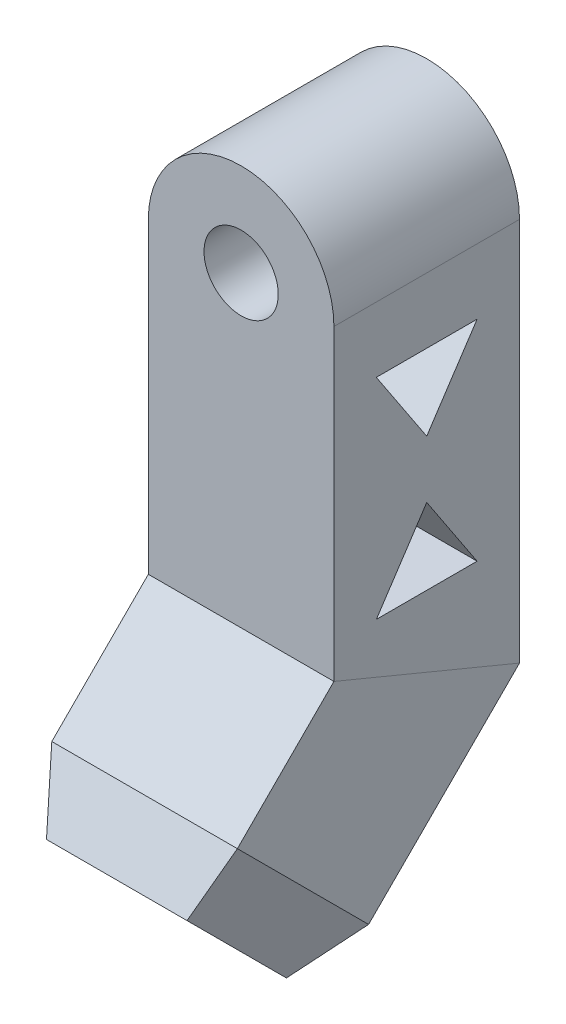
ISO-10303-21;
HEADER;
FILE_DESCRIPTION(('STEP AP214'),'2;1');
FILE_NAME('part.step','',(''),(''),'','','');
FILE_SCHEMA(('AUTOMOTIVE_DESIGN { 1 0 10303 214 1 1 1 1 }'));
ENDSEC;
DATA;
#1=APPLICATION_CONTEXT('core data for automotive mechanical design processes');
#2=APPLICATION_PROTOCOL_DEFINITION('international standard','automotive_design',2000,#1);
#3=PRODUCT_CONTEXT('',#1,'mechanical');
#4=PRODUCT('Part','Part','',(#3));
#5=PRODUCT_RELATED_PRODUCT_CATEGORY('part','',(#4));
#6=PRODUCT_DEFINITION_FORMATION('','',#4);
#7=PRODUCT_DEFINITION_CONTEXT('part definition',#1,'design');
#8=PRODUCT_DEFINITION('design','',#6,#7);
#9=PRODUCT_DEFINITION_SHAPE('','',#8);
#10=(LENGTH_UNIT() NAMED_UNIT(*) SI_UNIT(.MILLI.,.METRE.));
#11=(NAMED_UNIT(*) PLANE_ANGLE_UNIT() SI_UNIT($,.RADIAN.));
#12=(NAMED_UNIT(*) SI_UNIT($,.STERADIAN.) SOLID_ANGLE_UNIT());
#13=UNCERTAINTY_MEASURE_WITH_UNIT(LENGTH_MEASURE(1.E-05),#10,'distance_accuracy_value','');
#14=(GEOMETRIC_REPRESENTATION_CONTEXT(3) GLOBAL_UNCERTAINTY_ASSIGNED_CONTEXT((#13)) GLOBAL_UNIT_ASSIGNED_CONTEXT((#10,
#11,#12)) REPRESENTATION_CONTEXT('',''));
#15=CARTESIAN_POINT('',(0.,0.,0.));
#16=DIRECTION('',(0.,0.,1.));
#17=DIRECTION('',(1.,0.,0.));
#18=AXIS2_PLACEMENT_3D('',#15,#16,#17);
#19=CARTESIAN_POINT('',(19.05,45.0786722599583,7.26209610324912));
#20=DIRECTION('',(-1.,0.,0.));
#21=DIRECTION('',(0.,0.,1.));
#22=AXIS2_PLACEMENT_3D('',#19,#20,#21);
#23=PLANE('',#22);
#24=DIRECTION('',(0.,0.382683432365091,0.923879532511287));
#25=VECTOR('',#24,1.);
#26=CARTESIAN_POINT('',(19.05,42.5318762324136,41.3600079491902));
#27=LINE('',#26,#25);
#28=CARTESIAN_POINT('',(19.05,17.5092316367925,-19.05));
#29=VERTEX_POINT('',#28);
#30=CARTESIAN_POINT('',(19.05,33.2907683632075,19.05));
#31=VERTEX_POINT('',#30);
#32=EDGE_CURVE('E278',#29,#31,#27,.T.);
#33=ORIENTED_EDGE('',*,*,#32,.T.);
#34=DIRECTION('',(0.,-0.707106781186546,0.707106781186549));
#35=VECTOR('',#34,1.);
#36=CARTESIAN_POINT('',(19.05,45.0786722599583,7.26209610324912));
#37=LINE('',#36,#35);
#38=CARTESIAN_POINT('',(19.05,13.4703841816038,38.8703841816038));
#39=VERTEX_POINT('',#38);
#40=EDGE_CURVE('E49',#31,#39,#37,.T.);
#41=ORIENTED_EDGE('',*,*,#40,.T.);
#42=DIRECTION('',(0.,-0.707106781186549,-0.707106781186546));
#43=VECTOR('',#42,1.);
#44=CARTESIAN_POINT('',(19.05,13.4703841816038,38.8703841816038));
#45=LINE('',#44,#43);
#46=CARTESIAN_POINT('',(19.05,-13.4703841816038,11.9296158183964));
#47=VERTEX_POINT('',#46);
#48=EDGE_CURVE('E317',#39,#47,#45,.T.);
#49=ORIENTED_EDGE('',*,*,#48,.T.);
#50=DIRECTION('',(0.,-0.707106781186546,0.707106781186549));
#51=VECTOR('',#50,1.);
#52=CARTESIAN_POINT('',(19.05,18.1379038967508,-19.6786722599583));
#53=LINE('',#52,#51);
#54=EDGE_CURVE('E328',#29,#47,#53,.T.);
#55=ORIENTED_EDGE('',*,*,#54,.F.);
#56=EDGE_LOOP('',(#33,#41,#49,#55));
#57=FACE_BOUND('',#56,.T.);
#58=ADVANCED_FACE('F45',(#57),#23,.F.);
#59=CARTESIAN_POINT('',(-19.05,18.1379038967508,-19.6786722599583));
#60=DIRECTION('',(0.,0.707106781186549,0.707106781186546));
#61=DIRECTION('',(0.,-0.707106781186546,0.707106781186549));
#62=AXIS2_PLACEMENT_3D('',#59,#60,#61);
#63=PLANE('',#62);
#64=DIRECTION('',(1.,0.,0.));
#65=VECTOR('',#64,1.);
#66=CARTESIAN_POINT('',(-19.05,17.5092316367925,-19.05));
#67=LINE('',#66,#65);
#68=CARTESIAN_POINT('',(-19.05,17.5092316367925,-19.05));
#69=VERTEX_POINT('',#68);
#70=EDGE_CURVE('E11',#69,#29,#67,.T.);
#71=ORIENTED_EDGE('',*,*,#70,.T.);
#72=ORIENTED_EDGE('',*,*,#54,.T.);
#73=DIRECTION('',(-1.,0.,0.));
#74=VECTOR('',#73,1.);
#75=CARTESIAN_POINT('',(-19.05,-13.4703841816038,11.9296158183964));
#76=LINE('',#75,#74);
#77=CARTESIAN_POINT('',(-19.05,-13.4703841816038,11.9296158183964));
#78=VERTEX_POINT('',#77);
#79=EDGE_CURVE('E313',#47,#78,#76,.T.);
#80=ORIENTED_EDGE('',*,*,#79,.T.);
#81=DIRECTION('',(0.,-0.707106781186546,0.707106781186549));
#82=VECTOR('',#81,1.);
#83=CARTESIAN_POINT('',(-19.05,18.1379038967508,-19.6786722599583));
#84=LINE('',#83,#82);
#85=EDGE_CURVE('E325',#69,#78,#84,.T.);
#86=ORIENTED_EDGE('',*,*,#85,.F.);
#87=EDGE_LOOP('',(#71,#72,#80,#86));
#88=FACE_BOUND('',#87,.T.);
#89=ADVANCED_FACE('F352',(#88),#63,.F.);
#90=CARTESIAN_POINT('',(-19.05,45.0786722599583,7.26209610324912));
#91=DIRECTION('',(1.,0.,0.));
#92=DIRECTION('',(0.,0.,-1.));
#93=AXIS2_PLACEMENT_3D('',#90,#91,#92);
#94=PLANE('',#93);
#95=DIRECTION('',(0.,-0.382683432365091,-0.923879532511287));
#96=VECTOR('',#95,1.);
#97=CARTESIAN_POINT('',(-19.05,42.5318762324136,41.3600079491902));
#98=LINE('',#97,#96);
#99=CARTESIAN_POINT('',(-19.05,33.2907683632075,19.05));
#100=VERTEX_POINT('',#99);
#101=EDGE_CURVE('E55',#100,#69,#98,.T.);
#102=ORIENTED_EDGE('',*,*,#101,.T.);
#103=ORIENTED_EDGE('',*,*,#85,.T.);
#104=DIRECTION('',(0.,0.707106781186549,0.707106781186546));
#105=VECTOR('',#104,1.);
#106=CARTESIAN_POINT('',(-19.05,13.4703841816038,38.8703841816038));
#107=LINE('',#106,#105);
#108=CARTESIAN_POINT('',(-19.05,13.4703841816038,38.8703841816038));
#109=VERTEX_POINT('',#108);
#110=EDGE_CURVE('E309',#78,#109,#107,.T.);
#111=ORIENTED_EDGE('',*,*,#110,.T.);
#112=DIRECTION('',(0.,-0.707106781186546,0.707106781186549));
#113=VECTOR('',#112,1.);
#114=CARTESIAN_POINT('',(-19.05,45.0786722599583,7.26209610324912));
#115=LINE('',#114,#113);
#116=EDGE_CURVE('E321',#100,#109,#115,.T.);
#117=ORIENTED_EDGE('',*,*,#116,.F.);
#118=EDGE_LOOP('',(#102,#103,#111,#117));
#119=FACE_BOUND('',#118,.T.);
#120=ADVANCED_FACE('F350',(#119),#94,.F.);
#121=CARTESIAN_POINT('',(-19.05,45.0786722599583,7.26209610324912));
#122=DIRECTION('',(0.,-0.707106781186549,-0.707106781186546));
#123=DIRECTION('',(0.,0.707106781186546,-0.707106781186549));
#124=AXIS2_PLACEMENT_3D('',#121,#122,#123);
#125=PLANE('',#124);
#126=DIRECTION('',(-1.,0.,0.));
#127=VECTOR('',#126,1.);
#128=CARTESIAN_POINT('',(-19.05,33.2907683632075,19.05));
#129=LINE('',#128,#127);
#130=EDGE_CURVE('E274',#31,#100,#129,.T.);
#131=ORIENTED_EDGE('',*,*,#130,.T.);
#132=ORIENTED_EDGE('',*,*,#116,.T.);
#133=DIRECTION('',(1.,0.,0.));
#134=VECTOR('',#133,1.);
#135=CARTESIAN_POINT('',(-19.05,13.4703841816038,38.8703841816038));
#136=LINE('',#135,#134);
#137=EDGE_CURVE('E247',#109,#39,#136,.T.);
#138=ORIENTED_EDGE('',*,*,#137,.T.);
#139=ORIENTED_EDGE('',*,*,#40,.F.);
#140=EDGE_LOOP('',(#131,#132,#138,#139));
#141=FACE_BOUND('',#140,.T.);
#142=ADVANCED_FACE('F47',(#141),#125,.F.);
#143=CARTESIAN_POINT('',(-19.05,96.393,19.05));
#144=DIRECTION('',(0.,0.,-1.));
#145=DIRECTION('',(0.,1.,0.));
#146=AXIS2_PLACEMENT_3D('',#143,#144,#145);
#147=PLANE('',#146);
#148=CARTESIAN_POINT('',(0.,96.393,19.05));
#149=DIRECTION('',(0.,0.,1.));
#150=DIRECTION('',(1.,0.,0.));
#151=AXIS2_PLACEMENT_3D('',#148,#149,#150);
#152=CIRCLE('',#151,7.62);
#153=CARTESIAN_POINT('',(7.62,96.393,19.05));
#154=VERTEX_POINT('',#153);
#155=EDGE_CURVE('E224',#154,#154,#152,.T.);
#156=ORIENTED_EDGE('',*,*,#155,.F.);
#157=EDGE_LOOP('',(#156));
#158=FACE_BOUND('',#157,.T.);
#159=DIRECTION('',(0.,-1.,0.));
#160=VECTOR('',#159,1.);
#161=CARTESIAN_POINT('',(19.05,96.393,19.05));
#162=LINE('',#161,#160);
#163=CARTESIAN_POINT('',(19.05,96.393,19.05));
#164=VERTEX_POINT('',#163);
#165=EDGE_CURVE('E289',#164,#31,#162,.T.);
#166=ORIENTED_EDGE('',*,*,#165,.F.);
#167=CARTESIAN_POINT('',(0.,96.393,19.05));
#168=DIRECTION('',(0.,0.,-1.));
#169=DIRECTION('',(0.,1.,0.));
#170=AXIS2_PLACEMENT_3D('',#167,#168,#169);
#171=CIRCLE('',#170,19.05);
#172=CARTESIAN_POINT('',(-19.05,96.393,19.05));
#173=VERTEX_POINT('',#172);
#174=EDGE_CURVE('E236',#164,#173,#171,.F.);
#175=ORIENTED_EDGE('',*,*,#174,.T.);
#176=DIRECTION('',(0.,-1.,0.));
#177=VECTOR('',#176,1.);
#178=CARTESIAN_POINT('',(-19.05,96.393,19.05));
#179=LINE('',#178,#177);
#180=EDGE_CURVE('E296',#173,#100,#179,.T.);
#181=ORIENTED_EDGE('',*,*,#180,.T.);
#182=ORIENTED_EDGE('',*,*,#130,.F.);
#183=EDGE_LOOP('',(#166,#175,#181,#182));
#184=FACE_BOUND('',#183,.T.);
#185=ADVANCED_FACE('F383',(#158,#184),#147,.F.);
#186=CARTESIAN_POINT('',(-19.05,96.393,19.05));
#187=DIRECTION('',(1.,0.,0.));
#188=DIRECTION('',(0.,0.,-1.));
#189=AXIS2_PLACEMENT_3D('',#186,#187,#188);
#190=PLANE('',#189);
#191=DIRECTION('',(0.,0.833779661271235,0.552097343274196));
#192=VECTOR('',#191,1.);
#193=CARTESIAN_POINT('',(-19.05,82.9999979899142,10.3451695250034));
#194=LINE('',#193,#192);
#195=CARTESIAN_POINT('',(-19.05,67.3766807480723,0.));
#196=VERTEX_POINT('',#195);
#197=CARTESIAN_POINT('',(-19.05,82.9999979899142,10.3451695250034));
#198=VERTEX_POINT('',#197);
#199=EDGE_CURVE('E174',#196,#198,#194,.T.);
#200=ORIENTED_EDGE('',*,*,#199,.F.);
#201=DIRECTION('',(0.,-0.833779661271235,0.552097343274195));
#202=VECTOR('',#201,1.);
#203=CARTESIAN_POINT('',(-19.05,82.9999979899142,-10.3451695250034));
#204=LINE('',#203,#202);
#205=CARTESIAN_POINT('',(-19.05,82.9999979899142,-10.3451695250034));
#206=VERTEX_POINT('',#205);
#207=EDGE_CURVE('E63',#206,#196,#204,.T.);
#208=ORIENTED_EDGE('',*,*,#207,.F.);
#209=DIRECTION('',(0.,0.,-1.));
#210=VECTOR('',#209,1.);
#211=CARTESIAN_POINT('',(-19.05,82.9999979899142,-10.3451695250034));
#212=LINE('',#211,#210);
#213=EDGE_CURVE('E170',#198,#206,#212,.T.);
#214=ORIENTED_EDGE('',*,*,#213,.F.);
#215=EDGE_LOOP('',(#200,#208,#214));
#216=FACE_BOUND('',#215,.T.);
#217=DIRECTION('',(0.,0.833779661271235,-0.552097343274196));
#218=VECTOR('',#217,1.);
#219=CARTESIAN_POINT('',(-19.05,39.9683350787719,10.3451695250034));
#220=LINE('',#219,#218);
#221=CARTESIAN_POINT('',(-19.05,39.9683350787719,10.3451695250034));
#222=VERTEX_POINT('',#221);
#223=CARTESIAN_POINT('',(-19.05,55.5916523206137,0.));
#224=VERTEX_POINT('',#223);
#225=EDGE_CURVE('E203',#222,#224,#220,.T.);
#226=ORIENTED_EDGE('',*,*,#225,.F.);
#227=DIRECTION('',(0.,0.,1.));
#228=VECTOR('',#227,1.);
#229=CARTESIAN_POINT('',(-19.05,39.9683350787719,-10.3451695250034));
#230=LINE('',#229,#228);
#231=CARTESIAN_POINT('',(-19.05,39.9683350787719,-10.3451695250034));
#232=VERTEX_POINT('',#231);
#233=EDGE_CURVE('E71',#232,#222,#230,.T.);
#234=ORIENTED_EDGE('',*,*,#233,.F.);
#235=DIRECTION('',(0.,-0.833779661271235,-0.552097343274195));
#236=VECTOR('',#235,1.);
#237=CARTESIAN_POINT('',(-19.05,39.9683350787719,-10.3451695250034));
#238=LINE('',#237,#236);
#239=EDGE_CURVE('E199',#224,#232,#238,.T.);
#240=ORIENTED_EDGE('',*,*,#239,.F.);
#241=EDGE_LOOP('',(#226,#234,#240));
#242=FACE_BOUND('',#241,.T.);
#243=ORIENTED_EDGE('',*,*,#180,.F.);
#244=DIRECTION('',(0.,0.,1.));
#245=VECTOR('',#244,1.);
#246=CARTESIAN_POINT('',(-19.05,96.393,19.05));
#247=LINE('',#246,#245);
#248=CARTESIAN_POINT('',(-19.05,96.393,-19.05));
#249=VERTEX_POINT('',#248);
#250=EDGE_CURVE('E283',#249,#173,#247,.T.);
#251=ORIENTED_EDGE('',*,*,#250,.F.);
#252=DIRECTION('',(0.,-1.,0.));
#253=VECTOR('',#252,1.);
#254=CARTESIAN_POINT('',(-19.05,96.393,-19.05));
#255=LINE('',#254,#253);
#256=EDGE_CURVE('E288',#249,#69,#255,.T.);
#257=ORIENTED_EDGE('',*,*,#256,.T.);
#258=ORIENTED_EDGE('',*,*,#101,.F.);
#259=EDGE_LOOP('',(#243,#251,#257,#258));
#260=FACE_BOUND('',#259,.T.);
#261=ADVANCED_FACE('F378',(#216,#242,#260),#190,.F.);
#262=CARTESIAN_POINT('',(-19.05,96.393,-19.05));
#263=DIRECTION('',(0.,0.,1.));
#264=DIRECTION('',(0.,-1.,0.));
#265=AXIS2_PLACEMENT_3D('',#262,#263,#264);
#266=PLANE('',#265);
#267=CARTESIAN_POINT('',(0.,96.393,-19.05));
#268=DIRECTION('',(0.,0.,1.));
#269=DIRECTION('',(1.,0.,0.));
#270=AXIS2_PLACEMENT_3D('',#267,#268,#269);
#271=CIRCLE('',#270,7.62);
#272=CARTESIAN_POINT('',(7.62,96.393,-19.05));
#273=VERTEX_POINT('',#272);
#274=EDGE_CURVE('E228',#273,#273,#271,.T.);
#275=ORIENTED_EDGE('',*,*,#274,.T.);
#276=EDGE_LOOP('',(#275));
#277=FACE_BOUND('',#276,.T.);
#278=ORIENTED_EDGE('',*,*,#256,.F.);
#279=CARTESIAN_POINT('',(0.,96.393,-19.05));
#280=DIRECTION('',(0.,0.,-1.));
#281=DIRECTION('',(0.,1.,0.));
#282=AXIS2_PLACEMENT_3D('',#279,#280,#281);
#283=CIRCLE('',#282,19.05);
#284=CARTESIAN_POINT('',(19.05,96.393,-19.05));
#285=VERTEX_POINT('',#284);
#286=EDGE_CURVE('E232',#249,#285,#283,.T.);
#287=ORIENTED_EDGE('',*,*,#286,.T.);
#288=DIRECTION('',(0.,-1.,0.));
#289=VECTOR('',#288,1.);
#290=CARTESIAN_POINT('',(19.05,96.393,-19.05));
#291=LINE('',#290,#289);
#292=EDGE_CURVE('E284',#285,#29,#291,.T.);
#293=ORIENTED_EDGE('',*,*,#292,.T.);
#294=ORIENTED_EDGE('',*,*,#70,.F.);
#295=EDGE_LOOP('',(#278,#287,#293,#294));
#296=FACE_BOUND('',#295,.T.);
#297=ADVANCED_FACE('F372',(#277,#296),#266,.F.);
#298=CARTESIAN_POINT('',(19.05,96.393,19.05));
#299=DIRECTION('',(-1.,0.,0.));
#300=DIRECTION('',(0.,0.,1.));
#301=AXIS2_PLACEMENT_3D('',#298,#299,#300);
#302=PLANE('',#301);
#303=DIRECTION('',(0.,0.,-1.));
#304=VECTOR('',#303,1.);
#305=CARTESIAN_POINT('',(19.05,82.9999979899142,-10.3451695250034));
#306=LINE('',#305,#304);
#307=CARTESIAN_POINT('',(19.05,82.9999979899142,10.3451695250034));
#308=VERTEX_POINT('',#307);
#309=CARTESIAN_POINT('',(19.05,82.9999979899142,-10.3451695250034));
#310=VERTEX_POINT('',#309);
#311=EDGE_CURVE('E158',#308,#310,#306,.T.);
#312=ORIENTED_EDGE('',*,*,#311,.T.);
#313=DIRECTION('',(0.,-0.833779661271235,0.552097343274195));
#314=VECTOR('',#313,1.);
#315=CARTESIAN_POINT('',(19.05,82.9999979899142,-10.3451695250034));
#316=LINE('',#315,#314);
#317=CARTESIAN_POINT('',(19.05,67.3766807480723,0.));
#318=VERTEX_POINT('',#317);
#319=EDGE_CURVE('E151',#310,#318,#316,.T.);
#320=ORIENTED_EDGE('',*,*,#319,.T.);
#321=DIRECTION('',(0.,0.833779661271235,0.552097343274196));
#322=VECTOR('',#321,1.);
#323=CARTESIAN_POINT('',(19.05,82.9999979899142,10.3451695250034));
#324=LINE('',#323,#322);
#325=EDGE_CURVE('E162',#318,#308,#324,.T.);
#326=ORIENTED_EDGE('',*,*,#325,.T.);
#327=EDGE_LOOP('',(#312,#320,#326));
#328=FACE_BOUND('',#327,.T.);
#329=DIRECTION('',(0.,-0.833779661271235,-0.552097343274195));
#330=VECTOR('',#329,1.);
#331=CARTESIAN_POINT('',(19.05,39.9683350787719,-10.3451695250034));
#332=LINE('',#331,#330);
#333=CARTESIAN_POINT('',(19.05,55.5916523206137,0.));
#334=VERTEX_POINT('',#333);
#335=CARTESIAN_POINT('',(19.05,39.9683350787719,-10.3451695250034));
#336=VERTEX_POINT('',#335);
#337=EDGE_CURVE('E192',#334,#336,#332,.T.);
#338=ORIENTED_EDGE('',*,*,#337,.T.);
#339=DIRECTION('',(0.,0.,1.));
#340=VECTOR('',#339,1.);
#341=CARTESIAN_POINT('',(19.05,39.9683350787719,-10.3451695250034));
#342=LINE('',#341,#340);
#343=CARTESIAN_POINT('',(19.05,39.9683350787719,10.3451695250034));
#344=VERTEX_POINT('',#343);
#345=EDGE_CURVE('E204',#336,#344,#342,.T.);
#346=ORIENTED_EDGE('',*,*,#345,.T.);
#347=DIRECTION('',(0.,0.833779661271235,-0.552097343274196));
#348=VECTOR('',#347,1.);
#349=CARTESIAN_POINT('',(19.05,39.9683350787719,10.3451695250034));
#350=LINE('',#349,#348);
#351=EDGE_CURVE('E213',#344,#334,#350,.T.);
#352=ORIENTED_EDGE('',*,*,#351,.T.);
#353=EDGE_LOOP('',(#338,#346,#352));
#354=FACE_BOUND('',#353,.T.);
#355=ORIENTED_EDGE('',*,*,#292,.F.);
#356=DIRECTION('',(0.,0.,-1.));
#357=VECTOR('',#356,1.);
#358=CARTESIAN_POINT('',(19.05,96.393,19.05));
#359=LINE('',#358,#357);
#360=EDGE_CURVE('E279',#164,#285,#359,.T.);
#361=ORIENTED_EDGE('',*,*,#360,.F.);
#362=ORIENTED_EDGE('',*,*,#165,.T.);
#363=ORIENTED_EDGE('',*,*,#32,.F.);
#364=EDGE_LOOP('',(#355,#361,#362,#363));
#365=FACE_BOUND('',#364,.T.);
#366=ADVANCED_FACE('F167',(#328,#354,#365),#302,.F.);
#367=CARTESIAN_POINT('',(-19.05,-13.4703841816038,11.9296158183964));
#368=DIRECTION('',(0.,-0.906307787036651,-0.422618261740697));
#369=DIRECTION('',(0.,0.422618261740697,-0.906307787036651));
#370=AXIS2_PLACEMENT_3D('',#367,#368,#369);
#371=PLANE('',#370);
#372=ORIENTED_EDGE('',*,*,#79,.F.);
#373=DIRECTION('',(0.323615577118185,0.399876601840004,-0.857538139995741));
#374=VECTOR('',#373,1.);
#375=CARTESIAN_POINT('',(19.05,-13.4703841816038,11.9296158183964));
#376=LINE('',#375,#374);
#377=CARTESIAN_POINT('',(14.4275780248192,-19.1820943785168,24.1784178636216));
#378=VERTEX_POINT('',#377);
#379=EDGE_CURVE('E244',#378,#47,#376,.T.);
#380=ORIENTED_EDGE('',*,*,#379,.F.);
#381=DIRECTION('',(-1.,0.,0.));
#382=VECTOR('',#381,1.);
#383=CARTESIAN_POINT('',(-19.05,-19.1820943785168,24.1784178636216));
#384=LINE('',#383,#382);
#385=CARTESIAN_POINT('',(-14.4275780248192,-19.1820943785168,24.1784178636216));
#386=VERTEX_POINT('',#385);
#387=EDGE_CURVE('E240',#386,#378,#384,.F.);
#388=ORIENTED_EDGE('',*,*,#387,.F.);
#389=DIRECTION('',(-0.323615577118185,0.399876601840004,-0.857538139995741));
#390=VECTOR('',#389,1.);
#391=CARTESIAN_POINT('',(-19.05,-13.4703841816038,11.9296158183964));
#392=LINE('',#391,#390);
#393=EDGE_CURVE('E249',#386,#78,#392,.T.);
#394=ORIENTED_EDGE('',*,*,#393,.T.);
#395=EDGE_LOOP('',(#372,#380,#388,#394));
#396=FACE_BOUND('',#395,.T.);
#397=ADVANCED_FACE('F356',(#396),#371,.T.);
#398=CARTESIAN_POINT('',(19.05,-13.4703841816038,11.9296158183964));
#399=DIRECTION('',(0.939692620785908,-0.241844762647975,0.241844762647976));
#400=DIRECTION('',(0.249243569363955,0.,-0.968440830991091));
#401=AXIS2_PLACEMENT_3D('',#398,#399,#400);
#402=PLANE('',#401);
#403=ORIENTED_EDGE('',*,*,#48,.F.);
#404=DIRECTION('',(0.323615577118185,0.857538139995739,-0.399876601840008));
#405=VECTOR('',#404,1.);
#406=CARTESIAN_POINT('',(19.05,13.4703841816038,38.8703841816038));
#407=LINE('',#406,#405);
#408=CARTESIAN_POINT('',(14.4275780248192,1.22158213637858,44.5820943785169));
#409=VERTEX_POINT('',#408);
#410=EDGE_CURVE('E248',#409,#39,#407,.T.);
#411=ORIENTED_EDGE('',*,*,#410,.F.);
#412=DIRECTION('',(0.,-0.707106781186549,-0.707106781186546));
#413=VECTOR('',#412,1.);
#414=CARTESIAN_POINT('',(14.4275780248192,-22.4506403026729,20.9098719394655));
#415=LINE('',#414,#413);
#416=EDGE_CURVE('E263',#378,#409,#415,.F.);
#417=ORIENTED_EDGE('',*,*,#416,.F.);
#418=ORIENTED_EDGE('',*,*,#379,.T.);
#419=EDGE_LOOP('',(#403,#411,#417,#418));
#420=FACE_BOUND('',#419,.T.);
#421=ADVANCED_FACE('F361',(#420),#402,.T.);
#422=CARTESIAN_POINT('',(19.05,13.4703841816038,38.8703841816038));
#423=DIRECTION('',(0.,0.4226182617407,0.906307787036649));
#424=DIRECTION('',(0.,-0.90630778703665,0.4226182617407));
#425=AXIS2_PLACEMENT_3D('',#422,#423,#424);
#426=PLANE('',#425);
#427=ORIENTED_EDGE('',*,*,#137,.F.);
#428=DIRECTION('',(-0.323615577118185,0.857538139995739,-0.399876601840008));
#429=VECTOR('',#428,1.);
#430=CARTESIAN_POINT('',(-19.05,13.4703841816038,38.8703841816038));
#431=LINE('',#430,#429);
#432=CARTESIAN_POINT('',(-14.4275780248192,1.22158213637858,44.5820943785169));
#433=VERTEX_POINT('',#432);
#434=EDGE_CURVE('E253',#433,#109,#431,.T.);
#435=ORIENTED_EDGE('',*,*,#434,.F.);
#436=DIRECTION('',(1.,0.,0.));
#437=VECTOR('',#436,1.);
#438=CARTESIAN_POINT('',(19.05,1.22158213637857,44.5820943785169));
#439=LINE('',#438,#437);
#440=EDGE_CURVE('E266',#409,#433,#439,.F.);
#441=ORIENTED_EDGE('',*,*,#440,.F.);
#442=ORIENTED_EDGE('',*,*,#410,.T.);
#443=EDGE_LOOP('',(#427,#435,#441,#442));
#444=FACE_BOUND('',#443,.T.);
#445=ADVANCED_FACE('F342',(#444),#426,.T.);
#446=CARTESIAN_POINT('',(-19.05,13.4703841816038,38.8703841816038));
#447=DIRECTION('',(-0.939692620785908,-0.241844762647975,0.241844762647976));
#448=DIRECTION('',(0.249243569363955,0.,0.968440830991091));
#449=AXIS2_PLACEMENT_3D('',#446,#447,#448);
#450=PLANE('',#449);
#451=ORIENTED_EDGE('',*,*,#110,.F.);
#452=ORIENTED_EDGE('',*,*,#393,.F.);
#453=DIRECTION('',(0.,0.707106781186549,0.707106781186546));
#454=VECTOR('',#453,1.);
#455=CARTESIAN_POINT('',(-14.4275780248192,4.49012806053463,47.850640302673));
#456=LINE('',#455,#454);
#457=EDGE_CURVE('E254',#433,#386,#456,.F.);
#458=ORIENTED_EDGE('',*,*,#457,.F.);
#459=ORIENTED_EDGE('',*,*,#434,.T.);
#460=EDGE_LOOP('',(#451,#452,#458,#459));
#461=FACE_BOUND('',#460,.T.);
#462=ADVANCED_FACE('F347',(#461),#450,.T.);
#463=CARTESIAN_POINT('',(0.,-21.6802561210692,21.6802561210693));
#464=DIRECTION('',(0.,-0.707106781186546,0.707106781186549));
#465=DIRECTION('',(0.,-0.707106781186549,-0.707106781186546));
#466=AXIS2_PLACEMENT_3D('',#463,#464,#465);
#467=PLANE('',#466);
#468=CARTESIAN_POINT('',(0.,-8.98025612106913,34.3802561210692));
#469=DIRECTION('',(0.,-0.707106781186546,0.707106781186549));
#470=DIRECTION('',(0.,-0.707106781186549,-0.707106781186546));
#471=AXIS2_PLACEMENT_3D('',#468,#469,#470);
#472=CIRCLE('',#471,12.065);
#473=CARTESIAN_POINT('',(0.,-17.5114994360848,25.8490128060536));
#474=VERTEX_POINT('',#473);
#475=EDGE_CURVE('E186',#474,#474,#472,.T.);
#476=ORIENTED_EDGE('',*,*,#475,.F.);
#477=EDGE_LOOP('',(#476));
#478=FACE_BOUND('',#477,.T.);
#479=ORIENTED_EDGE('',*,*,#387,.T.);
#480=ORIENTED_EDGE('',*,*,#416,.T.);
#481=ORIENTED_EDGE('',*,*,#440,.T.);
#482=ORIENTED_EDGE('',*,*,#457,.T.);
#483=EDGE_LOOP('',(#479,#480,#481,#482));
#484=FACE_BOUND('',#483,.T.);
#485=ADVANCED_FACE('F359',(#478,#484),#467,.T.);
#486=CARTESIAN_POINT('',(0.,96.393,61.647094971371));
#487=DIRECTION('',(0.,0.,-1.));
#488=DIRECTION('',(0.,1.,0.));
#489=AXIS2_PLACEMENT_3D('',#486,#487,#488);
#490=CYLINDRICAL_SURFACE('',#489,19.05);
#491=ORIENTED_EDGE('',*,*,#174,.F.);
#492=ORIENTED_EDGE('',*,*,#360,.T.);
#493=ORIENTED_EDGE('',*,*,#286,.F.);
#494=ORIENTED_EDGE('',*,*,#250,.T.);
#495=EDGE_LOOP('',(#491,#492,#493,#494));
#496=FACE_BOUND('',#495,.T.);
#497=ADVANCED_FACE('F436',(#496),#490,.T.);
#498=CARTESIAN_POINT('',(0.,96.393,-19.05));
#499=DIRECTION('',(0.,0.,1.));
#500=DIRECTION('',(1.,0.,0.));
#501=AXIS2_PLACEMENT_3D('',#498,#499,#500);
#502=CYLINDRICAL_SURFACE('',#501,7.62);
#503=CARTESIAN_POINT('',(7.62,96.393,-19.05));
#504=CARTESIAN_POINT('',(7.62,96.393,-18.653125));
#505=CARTESIAN_POINT('',(7.62,96.393,-18.25625));
#506=CARTESIAN_POINT('',(7.62,96.393,-17.4625));
#507=CARTESIAN_POINT('',(7.62,96.393,-17.065625));
#508=CARTESIAN_POINT('',(7.62,96.393,-16.271875));
#509=CARTESIAN_POINT('',(7.62,96.393,-15.875));
#510=CARTESIAN_POINT('',(7.62,96.393,-15.08125));
#511=CARTESIAN_POINT('',(7.62,96.393,-14.684375));
#512=CARTESIAN_POINT('',(7.62,96.393,-13.890625));
#513=CARTESIAN_POINT('',(7.62,96.393,-13.49375));
#514=CARTESIAN_POINT('',(7.62,96.393,-12.7));
#515=CARTESIAN_POINT('',(7.62,96.393,-12.303125));
#516=CARTESIAN_POINT('',(7.62,96.393,-11.509375));
#517=CARTESIAN_POINT('',(7.62,96.393,-11.1125));
#518=CARTESIAN_POINT('',(7.62,96.393,-10.31875));
#519=CARTESIAN_POINT('',(7.62,96.393,-9.92187500000001));
#520=CARTESIAN_POINT('',(7.62,96.393,-9.12812500000001));
#521=CARTESIAN_POINT('',(7.62,96.393,-8.73125000000001));
#522=CARTESIAN_POINT('',(7.62,96.393,-7.93750000000001));
#523=CARTESIAN_POINT('',(7.62,96.393,-7.54062500000001));
#524=CARTESIAN_POINT('',(7.62,96.393,-6.74687500000001));
#525=CARTESIAN_POINT('',(7.62,96.393,-6.35000000000001));
#526=CARTESIAN_POINT('',(7.62,96.393,-5.55625000000001));
#527=CARTESIAN_POINT('',(7.62,96.393,-5.15937500000001));
#528=CARTESIAN_POINT('',(7.62,96.393,-4.36562500000001));
#529=CARTESIAN_POINT('',(7.62,96.393,-3.96875000000001));
#530=CARTESIAN_POINT('',(7.62,96.393,-3.17500000000001));
#531=CARTESIAN_POINT('',(7.62,96.393,-2.77812500000001));
#532=CARTESIAN_POINT('',(7.62,96.393,-1.98437500000001));
#533=CARTESIAN_POINT('',(7.62,96.393,-1.58750000000001));
#534=CARTESIAN_POINT('',(7.62,96.393,-0.793750000000011));
#535=CARTESIAN_POINT('',(7.62,96.393,-0.396875000000011));
#536=CARTESIAN_POINT('',(7.62,96.393,0.39687499999999));
#537=CARTESIAN_POINT('',(7.62,96.393,0.79374999999999));
#538=CARTESIAN_POINT('',(7.62,96.393,1.58749999999999));
#539=CARTESIAN_POINT('',(7.62,96.393,1.98437499999999));
#540=CARTESIAN_POINT('',(7.62,96.393,2.77812499999999));
#541=CARTESIAN_POINT('',(7.62,96.393,3.17499999999999));
#542=CARTESIAN_POINT('',(7.62,96.393,3.96874999999999));
#543=CARTESIAN_POINT('',(7.62,96.393,4.36562499999999));
#544=CARTESIAN_POINT('',(7.62,96.393,5.15937499999999));
#545=CARTESIAN_POINT('',(7.62,96.393,5.55624999999999));
#546=CARTESIAN_POINT('',(7.62,96.393,6.34999999999999));
#547=CARTESIAN_POINT('',(7.62,96.393,6.74687499999999));
#548=CARTESIAN_POINT('',(7.62,96.393,7.54062499999999));
#549=CARTESIAN_POINT('',(7.62,96.393,7.93749999999999));
#550=CARTESIAN_POINT('',(7.62,96.393,8.73124999999999));
#551=CARTESIAN_POINT('',(7.62,96.393,9.12812499999999));
#552=CARTESIAN_POINT('',(7.62,96.393,9.92187499999999));
#553=CARTESIAN_POINT('',(7.62,96.393,10.31875));
#554=CARTESIAN_POINT('',(7.62,96.393,11.1125));
#555=CARTESIAN_POINT('',(7.62,96.393,11.509375));
#556=CARTESIAN_POINT('',(7.62,96.393,12.303125));
#557=CARTESIAN_POINT('',(7.62,96.393,12.7));
#558=CARTESIAN_POINT('',(7.62,96.393,13.49375));
#559=CARTESIAN_POINT('',(7.62,96.393,13.890625));
#560=CARTESIAN_POINT('',(7.62,96.393,14.684375));
#561=CARTESIAN_POINT('',(7.62,96.393,15.08125));
#562=CARTESIAN_POINT('',(7.62,96.393,15.875));
#563=CARTESIAN_POINT('',(7.62,96.393,16.271875));
#564=CARTESIAN_POINT('',(7.62,96.393,17.065625));
#565=CARTESIAN_POINT('',(7.62,96.393,17.4625));
#566=CARTESIAN_POINT('',(7.62,96.393,18.25625));
#567=CARTESIAN_POINT('',(7.62,96.393,18.653125));
#568=CARTESIAN_POINT('',(7.62,96.393,19.05));
#569=B_SPLINE_CURVE_WITH_KNOTS('',3,(#503,#504,#505,#506,#507,#508,#509,#510,#511,#512,#513,
#514,#515,#516,#517,#518,#519,#520,#521,#522,#523,#524,#525,#526,#527,#528,#529,#530,#531,#532,
#533,#534,#535,#536,#537,#538,#539,#540,#541,#542,#543,#544,#545,#546,#547,#548,#549,#550,#551,
#552,#553,#554,#555,#556,#557,#558,#559,#560,#561,#562,#563,#564,#565,#566,#567,#568),
.UNSPECIFIED.,.F.,.F.,(4,2,2,2,2,2,2,2,2,2,2,2,2,2,2,2,2,2,2,2,2,2,2,2,2,2,2,2,2,2,2,2,4),(0.,
1.190625,2.38125,3.571875,4.7625,5.953125,7.14375,8.334375,9.525,10.715625,11.90625,13.096875,
14.2875,15.478125,16.66875,17.859375,19.05,20.240625,21.43125,22.621875,23.8125,25.003125,
26.19375,27.384375,28.575,29.765625,30.95625,32.146875,33.3375,34.528125,35.71875,36.909375,
38.1),.UNSPECIFIED.);
#570=EDGE_CURVE('BSEAM462',#273,#154,#569,.T.);
#571=ORIENTED_EDGE('',*,*,#274,.F.);
#572=ORIENTED_EDGE('',*,*,#155,.T.);
#573=ORIENTED_EDGE('',*,*,#570,.T.);
#574=ORIENTED_EDGE('',*,*,#570,.F.);
#575=EDGE_LOOP('',(#571,#573,#572,#574));
#576=FACE_BOUND('',#575,.T.);
#577=ADVANCED_FACE('F462',(#576),#502,.F.);
#578=CARTESIAN_POINT('',(0.,0.,25.4000000000001));
#579=DIRECTION('',(0.,-0.707106781186546,0.707106781186549));
#580=DIRECTION('',(0.,-0.707106781186549,-0.707106781186546));
#581=AXIS2_PLACEMENT_3D('',#578,#579,#580);
#582=CYLINDRICAL_SURFACE('',#581,12.065);
#583=CARTESIAN_POINT('',(0.,0.,25.4000000000001));
#584=DIRECTION('',(0.,-0.707106781186546,0.707106781186549));
#585=DIRECTION('',(0.,-0.707106781186549,-0.707106781186546));
#586=AXIS2_PLACEMENT_3D('',#583,#584,#585);
#587=CIRCLE('',#586,12.065);
#588=CARTESIAN_POINT('',(0.,-8.53124331501571,16.8687566849844));
#589=VERTEX_POINT('',#588);
#590=EDGE_CURVE('E220',#589,#589,#587,.T.);
#591=ORIENTED_EDGE('',*,*,#590,.F.);
#592=EDGE_LOOP('',(#591));
#593=FACE_BOUND('',#592,.T.);
#594=ORIENTED_EDGE('',*,*,#475,.T.);
#595=EDGE_LOOP('',(#594));
#596=FACE_BOUND('',#595,.T.);
#597=ADVANCED_FACE('F471',(#593,#596),#582,.F.);
#598=CARTESIAN_POINT('',(0.,0.,25.4000000000001));
#599=DIRECTION('',(0.,-0.707106781186546,0.707106781186549));
#600=DIRECTION('',(0.,-0.707106781186549,-0.707106781186546));
#601=AXIS2_PLACEMENT_3D('',#598,#599,#600);
#602=PLANE('',#601);
#603=ORIENTED_EDGE('',*,*,#590,.T.);
#604=EDGE_LOOP('',(#603));
#605=FACE_BOUND('',#604,.T.);
#606=ADVANCED_FACE('F480',(#605),#602,.T.);
#607=CARTESIAN_POINT('',(19.05,39.9683350787719,-10.3451695250034));
#608=DIRECTION('',(0.,-1.,0.));
#609=DIRECTION('',(0.,0.,-1.));
#610=AXIS2_PLACEMENT_3D('',#607,#608,#609);
#611=PLANE('',#610);
#612=ORIENTED_EDGE('',*,*,#233,.T.);
#613=DIRECTION('',(-1.,0.,0.));
#614=VECTOR('',#613,1.);
#615=CARTESIAN_POINT('',(19.05,39.9683350787719,10.3451695250034));
#616=LINE('',#615,#614);
#617=EDGE_CURVE('E189',#344,#222,#616,.T.);
#618=ORIENTED_EDGE('',*,*,#617,.F.);
#619=ORIENTED_EDGE('',*,*,#345,.F.);
#620=DIRECTION('',(-1.,0.,0.));
#621=VECTOR('',#620,1.);
#622=CARTESIAN_POINT('',(19.05,39.9683350787719,-10.3451695250034));
#623=LINE('',#622,#621);
#624=EDGE_CURVE('E196',#336,#232,#623,.T.);
#625=ORIENTED_EDGE('',*,*,#624,.T.);
#626=EDGE_LOOP('',(#612,#618,#619,#625));
#627=FACE_BOUND('',#626,.T.);
#628=ADVANCED_FACE('F490',(#627),#611,.F.);
#629=CARTESIAN_POINT('',(19.05,39.9683350787719,-10.3451695250034));
#630=DIRECTION('',(0.,0.552097343274195,-0.833779661271235));
#631=DIRECTION('',(0.,0.833779661271235,0.552097343274195));
#632=AXIS2_PLACEMENT_3D('',#629,#630,#631);
#633=PLANE('',#632);
#634=ORIENTED_EDGE('',*,*,#239,.T.);
#635=ORIENTED_EDGE('',*,*,#624,.F.);
#636=ORIENTED_EDGE('',*,*,#337,.F.);
#637=DIRECTION('',(-1.,0.,0.));
#638=VECTOR('',#637,1.);
#639=CARTESIAN_POINT('',(19.05,55.5916523206137,0.));
#640=LINE('',#639,#638);
#641=EDGE_CURVE('E193',#334,#224,#640,.T.);
#642=ORIENTED_EDGE('',*,*,#641,.T.);
#643=EDGE_LOOP('',(#634,#635,#636,#642));
#644=FACE_BOUND('',#643,.T.);
#645=ADVANCED_FACE('F499',(#644),#633,.F.);
#646=CARTESIAN_POINT('',(19.05,39.9683350787719,10.3451695250034));
#647=DIRECTION('',(0.,0.552097343274196,0.833779661271235));
#648=DIRECTION('',(0.,-0.833779661271235,0.552097343274196));
#649=AXIS2_PLACEMENT_3D('',#646,#647,#648);
#650=PLANE('',#649);
#651=ORIENTED_EDGE('',*,*,#225,.T.);
#652=ORIENTED_EDGE('',*,*,#641,.F.);
#653=ORIENTED_EDGE('',*,*,#351,.F.);
#654=ORIENTED_EDGE('',*,*,#617,.T.);
#655=EDGE_LOOP('',(#651,#652,#653,#654));
#656=FACE_BOUND('',#655,.T.);
#657=ADVANCED_FACE('F508',(#656),#650,.F.);
#658=CARTESIAN_POINT('',(19.05,82.9999979899142,-10.3451695250034));
#659=DIRECTION('',(0.,-0.552097343274195,-0.833779661271235));
#660=DIRECTION('',(0.,0.833779661271235,-0.552097343274195));
#661=AXIS2_PLACEMENT_3D('',#658,#659,#660);
#662=PLANE('',#661);
#663=ORIENTED_EDGE('',*,*,#207,.T.);
#664=DIRECTION('',(-1.,0.,0.));
#665=VECTOR('',#664,1.);
#666=CARTESIAN_POINT('',(19.05,67.3766807480723,0.));
#667=LINE('',#666,#665);
#668=EDGE_CURVE('E147',#318,#196,#667,.T.);
#669=ORIENTED_EDGE('',*,*,#668,.F.);
#670=ORIENTED_EDGE('',*,*,#319,.F.);
#671=DIRECTION('',(-1.,0.,0.));
#672=VECTOR('',#671,1.);
#673=CARTESIAN_POINT('',(19.05,82.9999979899142,-10.3451695250034));
#674=LINE('',#673,#672);
#675=EDGE_CURVE('E183',#310,#206,#674,.T.);
#676=ORIENTED_EDGE('',*,*,#675,.T.);
#677=EDGE_LOOP('',(#663,#669,#670,#676));
#678=FACE_BOUND('',#677,.T.);
#679=ADVANCED_FACE('F149',(#678),#662,.F.);
#680=CARTESIAN_POINT('',(19.05,82.9999979899142,-10.3451695250034));
#681=DIRECTION('',(0.,1.,0.));
#682=DIRECTION('',(0.,0.,1.));
#683=AXIS2_PLACEMENT_3D('',#680,#681,#682);
#684=PLANE('',#683);
#685=ORIENTED_EDGE('',*,*,#213,.T.);
#686=ORIENTED_EDGE('',*,*,#675,.F.);
#687=ORIENTED_EDGE('',*,*,#311,.F.);
#688=DIRECTION('',(-1.,0.,0.));
#689=VECTOR('',#688,1.);
#690=CARTESIAN_POINT('',(19.05,82.9999979899142,10.3451695250034));
#691=LINE('',#690,#689);
#692=EDGE_CURVE('E157',#308,#198,#691,.T.);
#693=ORIENTED_EDGE('',*,*,#692,.T.);
#694=EDGE_LOOP('',(#685,#686,#687,#693));
#695=FACE_BOUND('',#694,.T.);
#696=ADVANCED_FACE('F527',(#695),#684,.F.);
#697=CARTESIAN_POINT('',(19.05,82.9999979899142,10.3451695250034));
#698=DIRECTION('',(0.,-0.552097343274196,0.833779661271235));
#699=DIRECTION('',(0.,-0.833779661271235,-0.552097343274196));
#700=AXIS2_PLACEMENT_3D('',#697,#698,#699);
#701=PLANE('',#700);
#702=ORIENTED_EDGE('',*,*,#199,.T.);
#703=ORIENTED_EDGE('',*,*,#692,.F.);
#704=ORIENTED_EDGE('',*,*,#325,.F.);
#705=ORIENTED_EDGE('',*,*,#668,.T.);
#706=EDGE_LOOP('',(#702,#703,#704,#705));
#707=FACE_BOUND('',#706,.T.);
#708=ADVANCED_FACE('F163',(#707),#701,.F.);
#709=CLOSED_SHELL('',(#58,#89,#120,#142,#185,#261,#297,#366,#397,#421,#445,#462,#485,#497,#577,
#597,#606,#628,#645,#657,#679,#696,#708));
#710=MANIFOLD_SOLID_BREP('B2',#709);
#711=ADVANCED_BREP_SHAPE_REPRESENTATION('',(#18,#710),#14);
#712=SHAPE_DEFINITION_REPRESENTATION(#9,#711);
ENDSEC;
END-ISO-10303-21;
